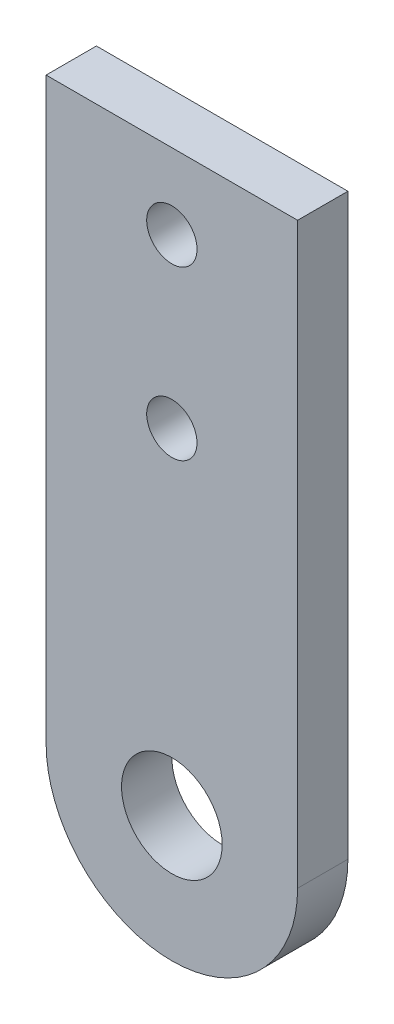
ISO-10303-21;
HEADER;
FILE_DESCRIPTION(('STEP AP214'),'2;1');
FILE_NAME('part.step','',(''),(''),'','','');
FILE_SCHEMA(('AUTOMOTIVE_DESIGN { 1 0 10303 214 1 1 1 1 }'));
ENDSEC;
DATA;
#1=APPLICATION_CONTEXT('core data for automotive mechanical design processes');
#2=APPLICATION_PROTOCOL_DEFINITION('international standard','automotive_design',2000,#1);
#3=PRODUCT_CONTEXT('',#1,'mechanical');
#4=PRODUCT('Part','Part','',(#3));
#5=PRODUCT_RELATED_PRODUCT_CATEGORY('part','',(#4));
#6=PRODUCT_DEFINITION_FORMATION('','',#4);
#7=PRODUCT_DEFINITION_CONTEXT('part definition',#1,'design');
#8=PRODUCT_DEFINITION('design','',#6,#7);
#9=PRODUCT_DEFINITION_SHAPE('','',#8);
#10=(LENGTH_UNIT() NAMED_UNIT(*) SI_UNIT(.MILLI.,.METRE.));
#11=(NAMED_UNIT(*) PLANE_ANGLE_UNIT() SI_UNIT($,.RADIAN.));
#12=(NAMED_UNIT(*) SI_UNIT($,.STERADIAN.) SOLID_ANGLE_UNIT());
#13=UNCERTAINTY_MEASURE_WITH_UNIT(LENGTH_MEASURE(1.E-05),#10,'distance_accuracy_value','');
#14=(GEOMETRIC_REPRESENTATION_CONTEXT(3) GLOBAL_UNCERTAINTY_ASSIGNED_CONTEXT((#13)) GLOBAL_UNIT_ASSIGNED_CONTEXT((#10,
#11,#12)) REPRESENTATION_CONTEXT('',''));
#15=CARTESIAN_POINT('',(0.,0.,0.));
#16=DIRECTION('',(0.,0.,1.));
#17=DIRECTION('',(1.,0.,0.));
#18=AXIS2_PLACEMENT_3D('',#15,#16,#17);
#19=CARTESIAN_POINT('',(7.49999999999999,21.,3.));
#20=DIRECTION('',(-1.,0.,0.));
#21=DIRECTION('',(0.,-1.,0.));
#22=AXIS2_PLACEMENT_3D('',#19,#20,#21);
#23=PLANE('',#22);
#24=DIRECTION('',(0.,1.,0.));
#25=VECTOR('',#24,1.);
#26=CARTESIAN_POINT('',(7.49999999999999,21.,3.));
#27=LINE('',#26,#25);
#28=CARTESIAN_POINT('',(7.5,-13.5,3.));
#29=VERTEX_POINT('',#28);
#30=CARTESIAN_POINT('',(7.49999999999999,21.,3.));
#31=VERTEX_POINT('',#30);
#32=EDGE_CURVE('E81',#29,#31,#27,.T.);
#33=ORIENTED_EDGE('',*,*,#32,.F.);
#34=DIRECTION('',(0.,0.,-1.));
#35=VECTOR('',#34,1.);
#36=CARTESIAN_POINT('',(7.5,-13.5,3.));
#37=LINE('',#36,#35);
#38=CARTESIAN_POINT('',(7.5,-13.5,0.));
#39=VERTEX_POINT('',#38);
#40=EDGE_CURVE('E11',#29,#39,#37,.T.);
#41=ORIENTED_EDGE('',*,*,#40,.T.);
#42=DIRECTION('',(0.,1.,0.));
#43=VECTOR('',#42,1.);
#44=CARTESIAN_POINT('',(7.49999999999999,21.,0.));
#45=LINE('',#44,#43);
#46=CARTESIAN_POINT('',(7.49999999999999,21.,0.));
#47=VERTEX_POINT('',#46);
#48=EDGE_CURVE('E103',#39,#47,#45,.T.);
#49=ORIENTED_EDGE('',*,*,#48,.T.);
#50=DIRECTION('',(0.,0.,-1.));
#51=VECTOR('',#50,1.);
#52=CARTESIAN_POINT('',(7.49999999999999,21.,3.));
#53=LINE('',#52,#51);
#54=EDGE_CURVE('E95',#31,#47,#53,.T.);
#55=ORIENTED_EDGE('',*,*,#54,.F.);
#56=EDGE_LOOP('',(#33,#41,#49,#55));
#57=FACE_BOUND('',#56,.T.);
#58=ADVANCED_FACE('F39',(#57),#23,.F.);
#59=CARTESIAN_POINT('',(-7.5,21.,3.));
#60=DIRECTION('',(0.,-1.,0.));
#61=DIRECTION('',(0.,0.,-1.));
#62=AXIS2_PLACEMENT_3D('',#59,#60,#61);
#63=PLANE('',#62);
#64=DIRECTION('',(-1.,0.,0.));
#65=VECTOR('',#64,1.);
#66=CARTESIAN_POINT('',(-7.5,21.,0.));
#67=LINE('',#66,#65);
#68=CARTESIAN_POINT('',(-7.5,21.,0.));
#69=VERTEX_POINT('',#68);
#70=EDGE_CURVE('E136',#47,#69,#67,.T.);
#71=ORIENTED_EDGE('',*,*,#70,.T.);
#72=DIRECTION('',(0.,0.,-1.));
#73=VECTOR('',#72,1.);
#74=CARTESIAN_POINT('',(-7.5,21.,3.));
#75=LINE('',#74,#73);
#76=CARTESIAN_POINT('',(-7.5,21.,3.));
#77=VERTEX_POINT('',#76);
#78=EDGE_CURVE('E97',#77,#69,#75,.T.);
#79=ORIENTED_EDGE('',*,*,#78,.F.);
#80=DIRECTION('',(-1.,0.,0.));
#81=VECTOR('',#80,1.);
#82=CARTESIAN_POINT('',(-7.5,21.,3.));
#83=LINE('',#82,#81);
#84=EDGE_CURVE('E84',#31,#77,#83,.T.);
#85=ORIENTED_EDGE('',*,*,#84,.F.);
#86=ORIENTED_EDGE('',*,*,#54,.T.);
#87=EDGE_LOOP('',(#71,#79,#85,#86));
#88=FACE_BOUND('',#87,.T.);
#89=ADVANCED_FACE('F94',(#88),#63,.F.);
#90=CARTESIAN_POINT('',(-7.5,21.,3.));
#91=DIRECTION('',(1.,0.,0.));
#92=DIRECTION('',(0.,1.,0.));
#93=AXIS2_PLACEMENT_3D('',#90,#91,#92);
#94=PLANE('',#93);
#95=DIRECTION('',(0.,-1.,0.));
#96=VECTOR('',#95,1.);
#97=CARTESIAN_POINT('',(-7.5,21.,0.));
#98=LINE('',#97,#96);
#99=CARTESIAN_POINT('',(-7.5,-13.5,0.));
#100=VERTEX_POINT('',#99);
#101=EDGE_CURVE('E90',#69,#100,#98,.T.);
#102=ORIENTED_EDGE('',*,*,#101,.T.);
#103=DIRECTION('',(0.,0.,-1.));
#104=VECTOR('',#103,1.);
#105=CARTESIAN_POINT('',(-7.5,-13.5,3.));
#106=LINE('',#105,#104);
#107=CARTESIAN_POINT('',(-7.5,-13.5,3.));
#108=VERTEX_POINT('',#107);
#109=EDGE_CURVE('E117',#100,#108,#106,.F.);
#110=ORIENTED_EDGE('',*,*,#109,.T.);
#111=DIRECTION('',(0.,-1.,0.));
#112=VECTOR('',#111,1.);
#113=CARTESIAN_POINT('',(-7.5,21.,3.));
#114=LINE('',#113,#112);
#115=EDGE_CURVE('E100',#77,#108,#114,.T.);
#116=ORIENTED_EDGE('',*,*,#115,.F.);
#117=ORIENTED_EDGE('',*,*,#78,.T.);
#118=EDGE_LOOP('',(#102,#110,#116,#117));
#119=FACE_BOUND('',#118,.T.);
#120=ADVANCED_FACE('F127',(#119),#94,.F.);
#121=CARTESIAN_POINT('',(0.,0.,3.));
#122=DIRECTION('',(0.,0.,1.));
#123=DIRECTION('',(1.,0.,0.));
#124=AXIS2_PLACEMENT_3D('',#121,#122,#123);
#125=PLANE('',#124);
#126=CARTESIAN_POINT('',(0.,16.5,3.));
#127=DIRECTION('',(0.,0.,1.));
#128=DIRECTION('',(1.,0.,0.));
#129=AXIS2_PLACEMENT_3D('',#126,#127,#128);
#130=CIRCLE('',#129,1.5);
#131=CARTESIAN_POINT('',(1.5,16.5,3.));
#132=VERTEX_POINT('',#131);
#133=EDGE_CURVE('E143',#132,#132,#130,.T.);
#134=ORIENTED_EDGE('',*,*,#133,.F.);
#135=EDGE_LOOP('',(#134));
#136=FACE_BOUND('',#135,.T.);
#137=CARTESIAN_POINT('',(0.,6.5,3.));
#138=DIRECTION('',(0.,0.,1.));
#139=DIRECTION('',(1.,0.,0.));
#140=AXIS2_PLACEMENT_3D('',#137,#138,#139);
#141=CIRCLE('',#140,1.5);
#142=CARTESIAN_POINT('',(1.5,6.5,3.));
#143=VERTEX_POINT('',#142);
#144=EDGE_CURVE('E151',#143,#143,#141,.T.);
#145=ORIENTED_EDGE('',*,*,#144,.F.);
#146=EDGE_LOOP('',(#145));
#147=FACE_BOUND('',#146,.T.);
#148=CARTESIAN_POINT('',(0.,-13.5,3.));
#149=DIRECTION('',(0.,0.,1.));
#150=DIRECTION('',(1.,0.,0.));
#151=AXIS2_PLACEMENT_3D('',#148,#149,#150);
#152=CIRCLE('',#151,3.);
#153=CARTESIAN_POINT('',(3.,-13.5,3.));
#154=VERTEX_POINT('',#153);
#155=EDGE_CURVE('E159',#154,#154,#152,.T.);
#156=ORIENTED_EDGE('',*,*,#155,.F.);
#157=EDGE_LOOP('',(#156));
#158=FACE_BOUND('',#157,.T.);
#159=ORIENTED_EDGE('',*,*,#115,.T.);
#160=CARTESIAN_POINT('',(0.,-13.5,3.));
#161=DIRECTION('',(0.,0.,1.));
#162=DIRECTION('',(1.,0.,0.));
#163=AXIS2_PLACEMENT_3D('',#160,#161,#162);
#164=CIRCLE('',#163,7.5);
#165=CARTESIAN_POINT('',(0.,-21.,3.));
#166=VERTEX_POINT('',#165);
#167=EDGE_CURVE('E49',#108,#166,#164,.T.);
#168=ORIENTED_EDGE('',*,*,#167,.T.);
#169=CARTESIAN_POINT('',(0.,-13.5,3.));
#170=DIRECTION('',(0.,0.,1.));
#171=DIRECTION('',(1.,0.,0.));
#172=AXIS2_PLACEMENT_3D('',#169,#170,#171);
#173=CIRCLE('',#172,7.5);
#174=EDGE_CURVE('E59',#166,#29,#173,.T.);
#175=ORIENTED_EDGE('',*,*,#174,.T.);
#176=ORIENTED_EDGE('',*,*,#32,.T.);
#177=ORIENTED_EDGE('',*,*,#84,.T.);
#178=EDGE_LOOP('',(#159,#168,#175,#176,#177));
#179=FACE_BOUND('',#178,.T.);
#180=ADVANCED_FACE('F83',(#136,#147,#158,#179),#125,.T.);
#181=CARTESIAN_POINT('',(0.,0.,0.));
#182=DIRECTION('',(0.,0.,1.));
#183=DIRECTION('',(1.,0.,0.));
#184=AXIS2_PLACEMENT_3D('',#181,#182,#183);
#185=PLANE('',#184);
#186=CARTESIAN_POINT('',(0.,16.5,0.));
#187=DIRECTION('',(0.,0.,1.));
#188=DIRECTION('',(1.,0.,0.));
#189=AXIS2_PLACEMENT_3D('',#186,#187,#188);
#190=CIRCLE('',#189,1.5);
#191=CARTESIAN_POINT('',(1.5,16.5,0.));
#192=VERTEX_POINT('',#191);
#193=EDGE_CURVE('E137',#192,#192,#190,.T.);
#194=ORIENTED_EDGE('',*,*,#193,.T.);
#195=EDGE_LOOP('',(#194));
#196=FACE_BOUND('',#195,.T.);
#197=CARTESIAN_POINT('',(0.,6.5,0.));
#198=DIRECTION('',(0.,0.,1.));
#199=DIRECTION('',(1.,0.,0.));
#200=AXIS2_PLACEMENT_3D('',#197,#198,#199);
#201=CIRCLE('',#200,1.5);
#202=CARTESIAN_POINT('',(1.5,6.5,0.));
#203=VERTEX_POINT('',#202);
#204=EDGE_CURVE('E147',#203,#203,#201,.T.);
#205=ORIENTED_EDGE('',*,*,#204,.T.);
#206=EDGE_LOOP('',(#205));
#207=FACE_BOUND('',#206,.T.);
#208=CARTESIAN_POINT('',(0.,-13.5,0.));
#209=DIRECTION('',(0.,0.,1.));
#210=DIRECTION('',(1.,0.,0.));
#211=AXIS2_PLACEMENT_3D('',#208,#209,#210);
#212=CIRCLE('',#211,3.);
#213=CARTESIAN_POINT('',(3.,-13.5,0.));
#214=VERTEX_POINT('',#213);
#215=EDGE_CURVE('E155',#214,#214,#212,.T.);
#216=ORIENTED_EDGE('',*,*,#215,.T.);
#217=EDGE_LOOP('',(#216));
#218=FACE_BOUND('',#217,.T.);
#219=CARTESIAN_POINT('',(0.,-13.5,0.));
#220=DIRECTION('',(0.,0.,1.));
#221=DIRECTION('',(1.,0.,0.));
#222=AXIS2_PLACEMENT_3D('',#219,#220,#221);
#223=CIRCLE('',#222,7.5);
#224=CARTESIAN_POINT('',(0.,-21.,0.));
#225=VERTEX_POINT('',#224);
#226=EDGE_CURVE('E106',#39,#225,#223,.F.);
#227=ORIENTED_EDGE('',*,*,#226,.T.);
#228=CARTESIAN_POINT('',(0.,-13.5,0.));
#229=DIRECTION('',(0.,0.,1.));
#230=DIRECTION('',(1.,0.,0.));
#231=AXIS2_PLACEMENT_3D('',#228,#229,#230);
#232=CIRCLE('',#231,7.5);
#233=EDGE_CURVE('E110',#225,#100,#232,.F.);
#234=ORIENTED_EDGE('',*,*,#233,.T.);
#235=ORIENTED_EDGE('',*,*,#101,.F.);
#236=ORIENTED_EDGE('',*,*,#70,.F.);
#237=ORIENTED_EDGE('',*,*,#48,.F.);
#238=EDGE_LOOP('',(#227,#234,#235,#236,#237));
#239=FACE_BOUND('',#238,.T.);
#240=ADVANCED_FACE('F170',(#196,#207,#218,#239),#185,.F.);
#241=CARTESIAN_POINT('',(0.,-13.5,0.));
#242=DIRECTION('',(0.,0.,1.));
#243=DIRECTION('',(1.,0.,0.));
#244=AXIS2_PLACEMENT_3D('',#241,#242,#243);
#245=CYLINDRICAL_SURFACE('',#244,3.);
#246=ORIENTED_EDGE('',*,*,#215,.F.);
#247=EDGE_LOOP('',(#246));
#248=FACE_BOUND('',#247,.T.);
#249=ORIENTED_EDGE('',*,*,#155,.T.);
#250=EDGE_LOOP('',(#249));
#251=FACE_BOUND('',#250,.T.);
#252=ADVANCED_FACE('F172',(#248,#251),#245,.F.);
#253=CARTESIAN_POINT('',(0.,6.5,0.));
#254=DIRECTION('',(0.,0.,1.));
#255=DIRECTION('',(1.,0.,0.));
#256=AXIS2_PLACEMENT_3D('',#253,#254,#255);
#257=CYLINDRICAL_SURFACE('',#256,1.5);
#258=ORIENTED_EDGE('',*,*,#204,.F.);
#259=EDGE_LOOP('',(#258));
#260=FACE_BOUND('',#259,.T.);
#261=ORIENTED_EDGE('',*,*,#144,.T.);
#262=EDGE_LOOP('',(#261));
#263=FACE_BOUND('',#262,.T.);
#264=ADVANCED_FACE('F179',(#260,#263),#257,.F.);
#265=CARTESIAN_POINT('',(0.,16.5,0.));
#266=DIRECTION('',(0.,0.,1.));
#267=DIRECTION('',(1.,0.,0.));
#268=AXIS2_PLACEMENT_3D('',#265,#266,#267);
#269=CYLINDRICAL_SURFACE('',#268,1.5);
#270=ORIENTED_EDGE('',*,*,#193,.F.);
#271=EDGE_LOOP('',(#270));
#272=FACE_BOUND('',#271,.T.);
#273=ORIENTED_EDGE('',*,*,#133,.T.);
#274=EDGE_LOOP('',(#273));
#275=FACE_BOUND('',#274,.T.);
#276=ADVANCED_FACE('F196',(#272,#275),#269,.F.);
#277=CARTESIAN_POINT('',(0.,-13.5,3.));
#278=DIRECTION('',(0.,0.,-1.));
#279=DIRECTION('',(-1.,0.,0.));
#280=AXIS2_PLACEMENT_3D('',#277,#278,#279);
#281=CYLINDRICAL_SURFACE('',#280,7.5);
#282=ORIENTED_EDGE('',*,*,#40,.F.);
#283=ORIENTED_EDGE('',*,*,#174,.F.);
#284=DIRECTION('',(0.,0.,-1.));
#285=VECTOR('',#284,1.);
#286=CARTESIAN_POINT('',(0.,-21.,3.));
#287=LINE('',#286,#285);
#288=EDGE_CURVE('E43',#225,#166,#287,.F.);
#289=ORIENTED_EDGE('',*,*,#288,.F.);
#290=ORIENTED_EDGE('',*,*,#226,.F.);
#291=EDGE_LOOP('',(#282,#283,#289,#290));
#292=FACE_BOUND('',#291,.T.);
#293=ADVANCED_FACE('F41',(#292),#281,.T.);
#294=CARTESIAN_POINT('',(0.,-13.5,3.));
#295=DIRECTION('',(0.,0.,-1.));
#296=DIRECTION('',(-1.,0.,0.));
#297=AXIS2_PLACEMENT_3D('',#294,#295,#296);
#298=CYLINDRICAL_SURFACE('',#297,7.5);
#299=ORIENTED_EDGE('',*,*,#167,.F.);
#300=ORIENTED_EDGE('',*,*,#109,.F.);
#301=ORIENTED_EDGE('',*,*,#233,.F.);
#302=ORIENTED_EDGE('',*,*,#288,.T.);
#303=EDGE_LOOP('',(#299,#300,#301,#302));
#304=FACE_BOUND('',#303,.T.);
#305=ADVANCED_FACE('F166',(#304),#298,.T.);
#306=CLOSED_SHELL('',(#58,#89,#120,#180,#240,#252,#264,#276,#293,#305));
#307=MANIFOLD_SOLID_BREP('B2',#306);
#308=ADVANCED_BREP_SHAPE_REPRESENTATION('',(#18,#307),#14);
#309=SHAPE_DEFINITION_REPRESENTATION(#9,#308);
ENDSEC;
END-ISO-10303-21;
